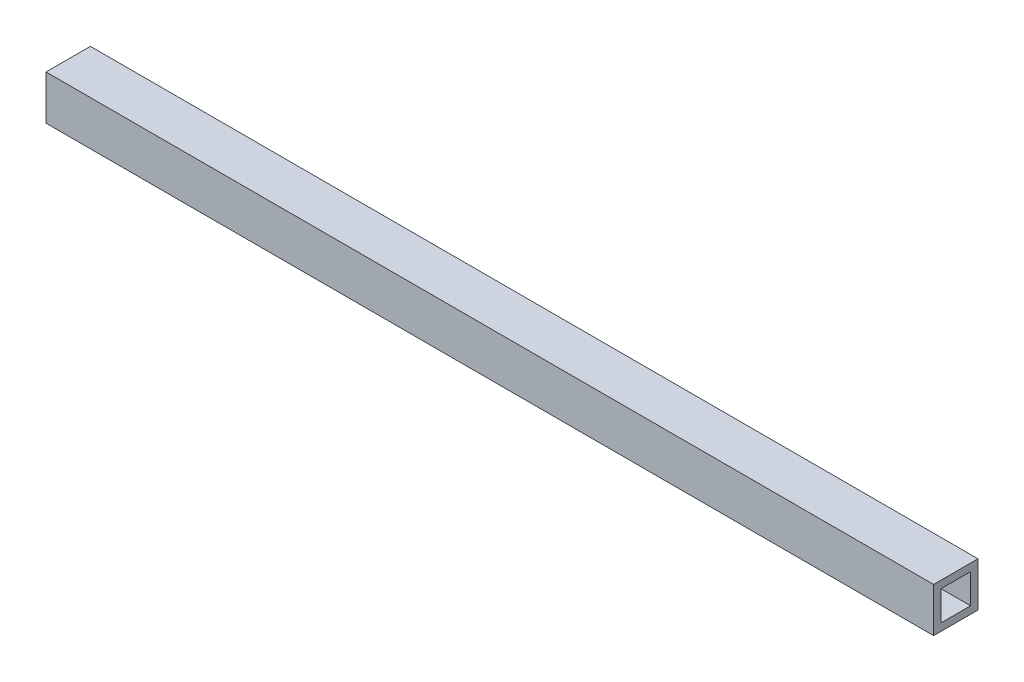
ISO-10303-21;
HEADER;
FILE_DESCRIPTION(('STEP AP214'),'2;1');
FILE_NAME('part.step','',(''),(''),'','','');
FILE_SCHEMA(('AUTOMOTIVE_DESIGN { 1 0 10303 214 1 1 1 1 }'));
ENDSEC;
DATA;
#1=APPLICATION_CONTEXT('core data for automotive mechanical design processes');
#2=APPLICATION_PROTOCOL_DEFINITION('international standard','automotive_design',2000,#1);
#3=PRODUCT_CONTEXT('',#1,'mechanical');
#4=PRODUCT('Part','Part','',(#3));
#5=PRODUCT_RELATED_PRODUCT_CATEGORY('part','',(#4));
#6=PRODUCT_DEFINITION_FORMATION('','',#4);
#7=PRODUCT_DEFINITION_CONTEXT('part definition',#1,'design');
#8=PRODUCT_DEFINITION('design','',#6,#7);
#9=PRODUCT_DEFINITION_SHAPE('','',#8);
#10=(LENGTH_UNIT() NAMED_UNIT(*) SI_UNIT(.MILLI.,.METRE.));
#11=(NAMED_UNIT(*) PLANE_ANGLE_UNIT() SI_UNIT($,.RADIAN.));
#12=(NAMED_UNIT(*) SI_UNIT($,.STERADIAN.) SOLID_ANGLE_UNIT());
#13=UNCERTAINTY_MEASURE_WITH_UNIT(LENGTH_MEASURE(1.E-05),#10,'distance_accuracy_value','');
#14=(GEOMETRIC_REPRESENTATION_CONTEXT(3) GLOBAL_UNCERTAINTY_ASSIGNED_CONTEXT((#13)) GLOBAL_UNIT_ASSIGNED_CONTEXT((#10,
#11,#12)) REPRESENTATION_CONTEXT('',''));
#15=CARTESIAN_POINT('',(0.,0.,0.));
#16=DIRECTION('',(0.,0.,1.));
#17=DIRECTION('',(1.,0.,0.));
#18=AXIS2_PLACEMENT_3D('',#15,#16,#17);
#19=CARTESIAN_POINT('',(190.5,0.,0.));
#20=DIRECTION('',(-1.,0.,0.));
#21=DIRECTION('',(0.,0.,1.));
#22=AXIS2_PLACEMENT_3D('',#19,#20,#21);
#23=PLANE('',#22);
#24=DIRECTION('',(0.,1.,0.));
#25=VECTOR('',#24,1.);
#26=CARTESIAN_POINT('',(190.5,-9.525,-9.525));
#27=LINE('',#26,#25);
#28=CARTESIAN_POINT('',(190.5,-9.525,-9.525));
#29=VERTEX_POINT('',#28);
#30=CARTESIAN_POINT('',(190.5,9.525,-9.525));
#31=VERTEX_POINT('',#30);
#32=EDGE_CURVE('E136',#29,#31,#27,.T.);
#33=ORIENTED_EDGE('',*,*,#32,.T.);
#34=DIRECTION('',(0.,0.,1.));
#35=VECTOR('',#34,1.);
#36=CARTESIAN_POINT('',(190.5,9.525,9.525));
#37=LINE('',#36,#35);
#38=CARTESIAN_POINT('',(190.5,9.525,9.525));
#39=VERTEX_POINT('',#38);
#40=EDGE_CURVE('E139',#31,#39,#37,.T.);
#41=ORIENTED_EDGE('',*,*,#40,.T.);
#42=DIRECTION('',(0.,-1.,0.));
#43=VECTOR('',#42,1.);
#44=CARTESIAN_POINT('',(190.5,-9.525,9.525));
#45=LINE('',#44,#43);
#46=CARTESIAN_POINT('',(190.5,-9.525,9.525));
#47=VERTEX_POINT('',#46);
#48=EDGE_CURVE('E142',#39,#47,#45,.T.);
#49=ORIENTED_EDGE('',*,*,#48,.T.);
#50=DIRECTION('',(0.,0.,-1.));
#51=VECTOR('',#50,1.);
#52=CARTESIAN_POINT('',(190.5,-9.525,9.525));
#53=LINE('',#52,#51);
#54=EDGE_CURVE('E144',#47,#29,#53,.T.);
#55=ORIENTED_EDGE('',*,*,#54,.T.);
#56=EDGE_LOOP('',(#33,#41,#49,#55));
#57=FACE_BOUND('',#56,.T.);
#58=DIRECTION('',(0.,-1.,0.));
#59=VECTOR('',#58,1.);
#60=CARTESIAN_POINT('',(190.5,-6.35,6.35));
#61=LINE('',#60,#59);
#62=CARTESIAN_POINT('',(190.5,6.35,6.35));
#63=VERTEX_POINT('',#62);
#64=CARTESIAN_POINT('',(190.5,-6.35,6.35));
#65=VERTEX_POINT('',#64);
#66=EDGE_CURVE('E100',#63,#65,#61,.T.);
#67=ORIENTED_EDGE('',*,*,#66,.F.);
#68=DIRECTION('',(0.,0.,1.));
#69=VECTOR('',#68,1.);
#70=CARTESIAN_POINT('',(190.5,6.35,-6.35));
#71=LINE('',#70,#69);
#72=CARTESIAN_POINT('',(190.5,6.35,-6.35));
#73=VERTEX_POINT('',#72);
#74=EDGE_CURVE('E122',#73,#63,#71,.T.);
#75=ORIENTED_EDGE('',*,*,#74,.F.);
#76=DIRECTION('',(0.,1.,0.));
#77=VECTOR('',#76,1.);
#78=CARTESIAN_POINT('',(190.5,-6.35,-6.35));
#79=LINE('',#78,#77);
#80=CARTESIAN_POINT('',(190.5,-6.35,-6.35));
#81=VERTEX_POINT('',#80);
#82=EDGE_CURVE('E120',#81,#73,#79,.T.);
#83=ORIENTED_EDGE('',*,*,#82,.F.);
#84=DIRECTION('',(0.,0.,-1.));
#85=VECTOR('',#84,1.);
#86=CARTESIAN_POINT('',(190.5,-6.35,-6.35));
#87=LINE('',#86,#85);
#88=EDGE_CURVE('E108',#65,#81,#87,.T.);
#89=ORIENTED_EDGE('',*,*,#88,.F.);
#90=EDGE_LOOP('',(#67,#75,#83,#89));
#91=FACE_BOUND('',#90,.T.);
#92=ADVANCED_FACE('F35',(#57,#91),#23,.F.);
#93=CARTESIAN_POINT('',(-190.5,0.,0.));
#94=DIRECTION('',(-1.,0.,0.));
#95=DIRECTION('',(0.,0.,1.));
#96=AXIS2_PLACEMENT_3D('',#93,#94,#95);
#97=PLANE('',#96);
#98=DIRECTION('',(0.,1.,0.));
#99=VECTOR('',#98,1.);
#100=CARTESIAN_POINT('',(-190.5,-9.525,-9.525));
#101=LINE('',#100,#99);
#102=CARTESIAN_POINT('',(-190.5,-9.525,-9.525));
#103=VERTEX_POINT('',#102);
#104=CARTESIAN_POINT('',(-190.5,9.525,-9.525));
#105=VERTEX_POINT('',#104);
#106=EDGE_CURVE('E116',#103,#105,#101,.T.);
#107=ORIENTED_EDGE('',*,*,#106,.F.);
#108=DIRECTION('',(0.,0.,-1.));
#109=VECTOR('',#108,1.);
#110=CARTESIAN_POINT('',(-190.5,-9.525,9.525));
#111=LINE('',#110,#109);
#112=CARTESIAN_POINT('',(-190.5,-9.525,9.525));
#113=VERTEX_POINT('',#112);
#114=EDGE_CURVE('E140',#113,#103,#111,.T.);
#115=ORIENTED_EDGE('',*,*,#114,.F.);
#116=DIRECTION('',(0.,-1.,0.));
#117=VECTOR('',#116,1.);
#118=CARTESIAN_POINT('',(-190.5,-9.525,9.525));
#119=LINE('',#118,#117);
#120=CARTESIAN_POINT('',(-190.5,9.525,9.525));
#121=VERTEX_POINT('',#120);
#122=EDGE_CURVE('E151',#121,#113,#119,.T.);
#123=ORIENTED_EDGE('',*,*,#122,.F.);
#124=DIRECTION('',(0.,0.,1.));
#125=VECTOR('',#124,1.);
#126=CARTESIAN_POINT('',(-190.5,9.525,9.525));
#127=LINE('',#126,#125);
#128=EDGE_CURVE('E149',#105,#121,#127,.T.);
#129=ORIENTED_EDGE('',*,*,#128,.F.);
#130=EDGE_LOOP('',(#107,#115,#123,#129));
#131=FACE_BOUND('',#130,.T.);
#132=DIRECTION('',(0.,0.,1.));
#133=VECTOR('',#132,1.);
#134=CARTESIAN_POINT('',(-190.5,6.35,-6.35));
#135=LINE('',#134,#133);
#136=CARTESIAN_POINT('',(-190.5,6.35,-6.35));
#137=VERTEX_POINT('',#136);
#138=CARTESIAN_POINT('',(-190.5,6.35,6.35));
#139=VERTEX_POINT('',#138);
#140=EDGE_CURVE('E109',#137,#139,#135,.T.);
#141=ORIENTED_EDGE('',*,*,#140,.T.);
#142=DIRECTION('',(0.,-1.,0.));
#143=VECTOR('',#142,1.);
#144=CARTESIAN_POINT('',(-190.5,-6.35,6.35));
#145=LINE('',#144,#143);
#146=CARTESIAN_POINT('',(-190.5,-6.35,6.35));
#147=VERTEX_POINT('',#146);
#148=EDGE_CURVE('E58',#139,#147,#145,.T.);
#149=ORIENTED_EDGE('',*,*,#148,.T.);
#150=DIRECTION('',(0.,0.,-1.));
#151=VECTOR('',#150,1.);
#152=CARTESIAN_POINT('',(-190.5,-6.35,-6.35));
#153=LINE('',#152,#151);
#154=CARTESIAN_POINT('',(-190.5,-6.35,-6.35));
#155=VERTEX_POINT('',#154);
#156=EDGE_CURVE('E115',#147,#155,#153,.T.);
#157=ORIENTED_EDGE('',*,*,#156,.T.);
#158=DIRECTION('',(0.,1.,0.));
#159=VECTOR('',#158,1.);
#160=CARTESIAN_POINT('',(-190.5,-6.35,-6.35));
#161=LINE('',#160,#159);
#162=EDGE_CURVE('E128',#155,#137,#161,.T.);
#163=ORIENTED_EDGE('',*,*,#162,.T.);
#164=EDGE_LOOP('',(#141,#149,#157,#163));
#165=FACE_BOUND('',#164,.T.);
#166=ADVANCED_FACE('F169',(#131,#165),#97,.T.);
#167=CARTESIAN_POINT('',(190.5,-9.525,-9.525));
#168=DIRECTION('',(0.,0.,1.));
#169=DIRECTION('',(1.,0.,0.));
#170=AXIS2_PLACEMENT_3D('',#167,#168,#169);
#171=PLANE('',#170);
#172=ORIENTED_EDGE('',*,*,#106,.T.);
#173=DIRECTION('',(-1.,0.,0.));
#174=VECTOR('',#173,1.);
#175=CARTESIAN_POINT('',(190.5,9.525,-9.525));
#176=LINE('',#175,#174);
#177=EDGE_CURVE('E11',#31,#105,#176,.T.);
#178=ORIENTED_EDGE('',*,*,#177,.F.);
#179=ORIENTED_EDGE('',*,*,#32,.F.);
#180=DIRECTION('',(-1.,0.,0.));
#181=VECTOR('',#180,1.);
#182=CARTESIAN_POINT('',(190.5,-9.525,-9.525));
#183=LINE('',#182,#181);
#184=EDGE_CURVE('E146',#29,#103,#183,.T.);
#185=ORIENTED_EDGE('',*,*,#184,.T.);
#186=EDGE_LOOP('',(#172,#178,#179,#185));
#187=FACE_BOUND('',#186,.T.);
#188=ADVANCED_FACE('F37',(#187),#171,.F.);
#189=CARTESIAN_POINT('',(190.5,9.525,9.525));
#190=DIRECTION('',(0.,-1.,0.));
#191=DIRECTION('',(0.,0.,-1.));
#192=AXIS2_PLACEMENT_3D('',#189,#190,#191);
#193=PLANE('',#192);
#194=ORIENTED_EDGE('',*,*,#128,.T.);
#195=DIRECTION('',(-1.,0.,0.));
#196=VECTOR('',#195,1.);
#197=CARTESIAN_POINT('',(190.5,9.525,9.525));
#198=LINE('',#197,#196);
#199=EDGE_CURVE('E43',#39,#121,#198,.T.);
#200=ORIENTED_EDGE('',*,*,#199,.F.);
#201=ORIENTED_EDGE('',*,*,#40,.F.);
#202=ORIENTED_EDGE('',*,*,#177,.T.);
#203=EDGE_LOOP('',(#194,#200,#201,#202));
#204=FACE_BOUND('',#203,.T.);
#205=ADVANCED_FACE('F179',(#204),#193,.F.);
#206=CARTESIAN_POINT('',(190.5,-9.525,9.525));
#207=DIRECTION('',(0.,0.,-1.));
#208=DIRECTION('',(-1.,0.,0.));
#209=AXIS2_PLACEMENT_3D('',#206,#207,#208);
#210=PLANE('',#209);
#211=ORIENTED_EDGE('',*,*,#122,.T.);
#212=DIRECTION('',(-1.,0.,0.));
#213=VECTOR('',#212,1.);
#214=CARTESIAN_POINT('',(190.5,-9.525,9.525));
#215=LINE('',#214,#213);
#216=EDGE_CURVE('E156',#47,#113,#215,.T.);
#217=ORIENTED_EDGE('',*,*,#216,.F.);
#218=ORIENTED_EDGE('',*,*,#48,.F.);
#219=ORIENTED_EDGE('',*,*,#199,.T.);
#220=EDGE_LOOP('',(#211,#217,#218,#219));
#221=FACE_BOUND('',#220,.T.);
#222=ADVANCED_FACE('F163',(#221),#210,.F.);
#223=CARTESIAN_POINT('',(190.5,-9.525,9.525));
#224=DIRECTION('',(0.,1.,0.));
#225=DIRECTION('',(0.,0.,1.));
#226=AXIS2_PLACEMENT_3D('',#223,#224,#225);
#227=PLANE('',#226);
#228=ORIENTED_EDGE('',*,*,#114,.T.);
#229=ORIENTED_EDGE('',*,*,#184,.F.);
#230=ORIENTED_EDGE('',*,*,#54,.F.);
#231=ORIENTED_EDGE('',*,*,#216,.T.);
#232=EDGE_LOOP('',(#228,#229,#230,#231));
#233=FACE_BOUND('',#232,.T.);
#234=ADVANCED_FACE('F173',(#233),#227,.F.);
#235=CARTESIAN_POINT('',(190.5,-6.35,6.35));
#236=DIRECTION('',(0.,0.,-1.));
#237=DIRECTION('',(-1.,0.,0.));
#238=AXIS2_PLACEMENT_3D('',#235,#236,#237);
#239=PLANE('',#238);
#240=ORIENTED_EDGE('',*,*,#148,.F.);
#241=DIRECTION('',(-1.,0.,0.));
#242=VECTOR('',#241,1.);
#243=CARTESIAN_POINT('',(190.5,6.35,6.35));
#244=LINE('',#243,#242);
#245=EDGE_CURVE('E104',#63,#139,#244,.T.);
#246=ORIENTED_EDGE('',*,*,#245,.F.);
#247=ORIENTED_EDGE('',*,*,#66,.T.);
#248=DIRECTION('',(-1.,0.,0.));
#249=VECTOR('',#248,1.);
#250=CARTESIAN_POINT('',(190.5,-6.35,6.35));
#251=LINE('',#250,#249);
#252=EDGE_CURVE('E103',#65,#147,#251,.T.);
#253=ORIENTED_EDGE('',*,*,#252,.T.);
#254=EDGE_LOOP('',(#240,#246,#247,#253));
#255=FACE_BOUND('',#254,.T.);
#256=ADVANCED_FACE('F102',(#255),#239,.T.);
#257=CARTESIAN_POINT('',(190.5,-6.35,-6.35));
#258=DIRECTION('',(0.,1.,0.));
#259=DIRECTION('',(0.,0.,1.));
#260=AXIS2_PLACEMENT_3D('',#257,#258,#259);
#261=PLANE('',#260);
#262=ORIENTED_EDGE('',*,*,#156,.F.);
#263=ORIENTED_EDGE('',*,*,#252,.F.);
#264=ORIENTED_EDGE('',*,*,#88,.T.);
#265=DIRECTION('',(-1.,0.,0.));
#266=VECTOR('',#265,1.);
#267=CARTESIAN_POINT('',(190.5,-6.35,-6.35));
#268=LINE('',#267,#266);
#269=EDGE_CURVE('E117',#81,#155,#268,.T.);
#270=ORIENTED_EDGE('',*,*,#269,.T.);
#271=EDGE_LOOP('',(#262,#263,#264,#270));
#272=FACE_BOUND('',#271,.T.);
#273=ADVANCED_FACE('F112',(#272),#261,.T.);
#274=CARTESIAN_POINT('',(190.5,-6.35,-6.35));
#275=DIRECTION('',(0.,0.,1.));
#276=DIRECTION('',(1.,0.,0.));
#277=AXIS2_PLACEMENT_3D('',#274,#275,#276);
#278=PLANE('',#277);
#279=ORIENTED_EDGE('',*,*,#162,.F.);
#280=ORIENTED_EDGE('',*,*,#269,.F.);
#281=ORIENTED_EDGE('',*,*,#82,.T.);
#282=DIRECTION('',(-1.,0.,0.));
#283=VECTOR('',#282,1.);
#284=CARTESIAN_POINT('',(190.5,6.35,-6.35));
#285=LINE('',#284,#283);
#286=EDGE_CURVE('E50',#73,#137,#285,.T.);
#287=ORIENTED_EDGE('',*,*,#286,.T.);
#288=EDGE_LOOP('',(#279,#280,#281,#287));
#289=FACE_BOUND('',#288,.T.);
#290=ADVANCED_FACE('F202',(#289),#278,.T.);
#291=CARTESIAN_POINT('',(190.5,6.35,-6.35));
#292=DIRECTION('',(0.,-1.,0.));
#293=DIRECTION('',(0.,0.,-1.));
#294=AXIS2_PLACEMENT_3D('',#291,#292,#293);
#295=PLANE('',#294);
#296=ORIENTED_EDGE('',*,*,#140,.F.);
#297=ORIENTED_EDGE('',*,*,#286,.F.);
#298=ORIENTED_EDGE('',*,*,#74,.T.);
#299=ORIENTED_EDGE('',*,*,#245,.T.);
#300=EDGE_LOOP('',(#296,#297,#298,#299));
#301=FACE_BOUND('',#300,.T.);
#302=ADVANCED_FACE('F206',(#301),#295,.T.);
#303=CLOSED_SHELL('',(#92,#166,#188,#205,#222,#234,#256,#273,#290,#302));
#304=MANIFOLD_SOLID_BREP('B2',#303);
#305=ADVANCED_BREP_SHAPE_REPRESENTATION('',(#18,#304),#14);
#306=SHAPE_DEFINITION_REPRESENTATION(#9,#305);
ENDSEC;
END-ISO-10303-21;
